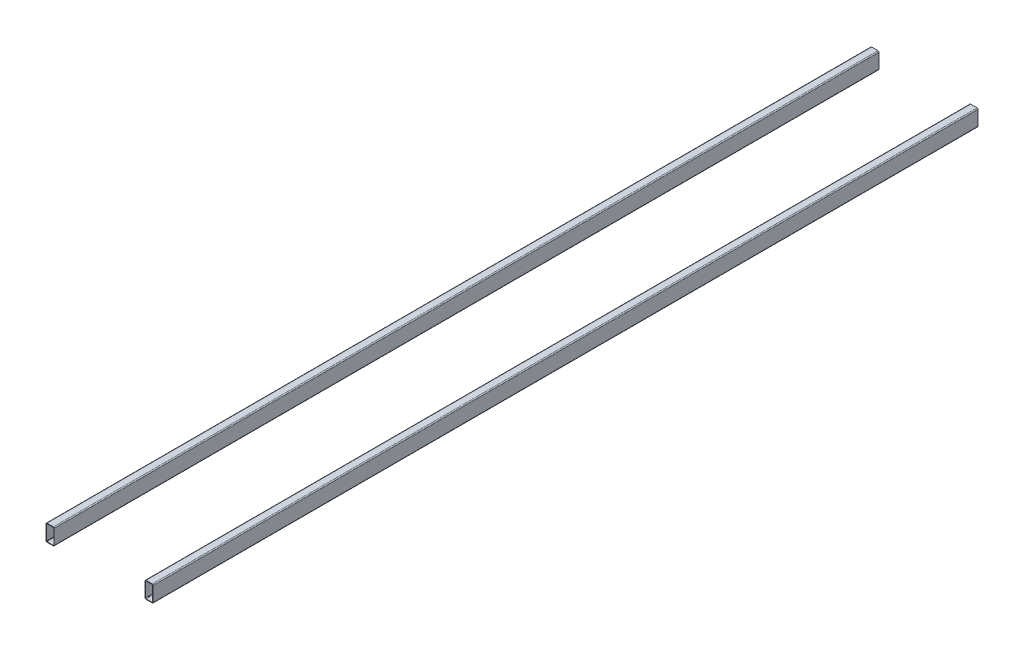
ISO-10303-21;
HEADER;
FILE_DESCRIPTION(('STEP AP214'),'2;1');
FILE_NAME('part.step','',(''),(''),'','','');
FILE_SCHEMA(('AUTOMOTIVE_DESIGN { 1 0 10303 214 1 1 1 1 }'));
ENDSEC;
DATA;
#1=APPLICATION_CONTEXT('core data for automotive mechanical design processes');
#2=APPLICATION_PROTOCOL_DEFINITION('international standard','automotive_design',2000,#1);
#3=PRODUCT_CONTEXT('',#1,'mechanical');
#4=PRODUCT('Part','Part','',(#3));
#5=PRODUCT_RELATED_PRODUCT_CATEGORY('part','',(#4));
#6=PRODUCT_DEFINITION_FORMATION('','',#4);
#7=PRODUCT_DEFINITION_CONTEXT('part definition',#1,'design');
#8=PRODUCT_DEFINITION('design','',#6,#7);
#9=PRODUCT_DEFINITION_SHAPE('','',#8);
#10=(LENGTH_UNIT() NAMED_UNIT(*) SI_UNIT(.MILLI.,.METRE.));
#11=(NAMED_UNIT(*) PLANE_ANGLE_UNIT() SI_UNIT($,.RADIAN.));
#12=(NAMED_UNIT(*) SI_UNIT($,.STERADIAN.) SOLID_ANGLE_UNIT());
#13=UNCERTAINTY_MEASURE_WITH_UNIT(LENGTH_MEASURE(1.E-05),#10,'distance_accuracy_value','');
#14=(GEOMETRIC_REPRESENTATION_CONTEXT(3) GLOBAL_UNCERTAINTY_ASSIGNED_CONTEXT((#13)) GLOBAL_UNIT_ASSIGNED_CONTEXT((#10,
#11,#12)) REPRESENTATION_CONTEXT('',''));
#15=CARTESIAN_POINT('',(0.,0.,0.));
#16=DIRECTION('',(0.,0.,1.));
#17=DIRECTION('',(1.,0.,0.));
#18=AXIS2_PLACEMENT_3D('',#15,#16,#17);
#19=CARTESIAN_POINT('',(281.,-44.,5000.));
#20=DIRECTION('',(0.,0.,1.));
#21=DIRECTION('',(1.,0.,0.));
#22=AXIS2_PLACEMENT_3D('',#19,#20,#21);
#23=PLANE('',#22);
#24=CARTESIAN_POINT('',(281.,-44.,5000.));
#25=DIRECTION('',(0.,0.,1.));
#26=DIRECTION('',(1.,0.,0.));
#27=AXIS2_PLACEMENT_3D('',#24,#25,#26);
#28=CIRCLE('',#27,6.00000000000002);
#29=CARTESIAN_POINT('',(275.,-44.,5000.));
#30=VERTEX_POINT('',#29);
#31=CARTESIAN_POINT('',(281.,-50.,5000.));
#32=VERTEX_POINT('',#31);
#33=EDGE_CURVE('E405',#30,#32,#28,.T.);
#34=ORIENTED_EDGE('',*,*,#33,.T.);
#35=DIRECTION('',(1.,0.,0.));
#36=VECTOR('',#35,1.);
#37=CARTESIAN_POINT('',(281.,-50.,5000.));
#38=LINE('',#37,#36);
#39=CARTESIAN_POINT('',(319.,-50.,5000.));
#40=VERTEX_POINT('',#39);
#41=EDGE_CURVE('E396',#32,#40,#38,.T.);
#42=ORIENTED_EDGE('',*,*,#41,.T.);
#43=CARTESIAN_POINT('',(319.,-44.,5000.));
#44=DIRECTION('',(0.,0.,1.));
#45=DIRECTION('',(1.,0.,0.));
#46=AXIS2_PLACEMENT_3D('',#43,#44,#45);
#47=CIRCLE('',#46,6.00000000000002);
#48=CARTESIAN_POINT('',(325.,-44.,5000.));
#49=VERTEX_POINT('',#48);
#50=EDGE_CURVE('E397',#40,#49,#47,.T.);
#51=ORIENTED_EDGE('',*,*,#50,.T.);
#52=DIRECTION('',(0.,1.,0.));
#53=VECTOR('',#52,1.);
#54=CARTESIAN_POINT('',(325.,-44.,5000.));
#55=LINE('',#54,#53);
#56=CARTESIAN_POINT('',(325.,44.,5000.));
#57=VERTEX_POINT('',#56);
#58=EDGE_CURVE('E391',#49,#57,#55,.T.);
#59=ORIENTED_EDGE('',*,*,#58,.T.);
#60=CARTESIAN_POINT('',(319.,44.,5000.));
#61=DIRECTION('',(0.,0.,1.));
#62=DIRECTION('',(1.,0.,0.));
#63=AXIS2_PLACEMENT_3D('',#60,#61,#62);
#64=CIRCLE('',#63,6.00000000000002);
#65=CARTESIAN_POINT('',(319.,50.,5000.));
#66=VERTEX_POINT('',#65);
#67=EDGE_CURVE('E388',#57,#66,#64,.T.);
#68=ORIENTED_EDGE('',*,*,#67,.T.);
#69=DIRECTION('',(-1.,0.,0.));
#70=VECTOR('',#69,1.);
#71=CARTESIAN_POINT('',(319.,50.,5000.));
#72=LINE('',#71,#70);
#73=CARTESIAN_POINT('',(281.,50.,5000.));
#74=VERTEX_POINT('',#73);
#75=EDGE_CURVE('E390',#66,#74,#72,.T.);
#76=ORIENTED_EDGE('',*,*,#75,.T.);
#77=CARTESIAN_POINT('',(281.,44.,5000.));
#78=DIRECTION('',(0.,0.,1.));
#79=DIRECTION('',(1.,0.,0.));
#80=AXIS2_PLACEMENT_3D('',#77,#78,#79);
#81=CIRCLE('',#80,6.00000000000002);
#82=CARTESIAN_POINT('',(275.,44.,5000.));
#83=VERTEX_POINT('',#82);
#84=EDGE_CURVE('E383',#74,#83,#81,.T.);
#85=ORIENTED_EDGE('',*,*,#84,.T.);
#86=DIRECTION('',(0.,-1.,0.));
#87=VECTOR('',#86,1.);
#88=CARTESIAN_POINT('',(275.,44.,5000.));
#89=LINE('',#88,#87);
#90=EDGE_CURVE('E381',#83,#30,#89,.T.);
#91=ORIENTED_EDGE('',*,*,#90,.T.);
#92=EDGE_LOOP('',(#34,#42,#51,#59,#68,#76,#85,#91));
#93=FACE_BOUND('',#92,.T.);
#94=DIRECTION('',(1.,0.,0.));
#95=VECTOR('',#94,1.);
#96=CARTESIAN_POINT('',(281.,-47.,5000.));
#97=LINE('',#96,#95);
#98=CARTESIAN_POINT('',(281.,-47.,5000.));
#99=VERTEX_POINT('',#98);
#100=CARTESIAN_POINT('',(319.,-47.,5000.));
#101=VERTEX_POINT('',#100);
#102=EDGE_CURVE('E100',#99,#101,#97,.T.);
#103=ORIENTED_EDGE('',*,*,#102,.F.);
#104=CARTESIAN_POINT('',(281.,-44.,5000.));
#105=DIRECTION('',(0.,0.,1.));
#106=DIRECTION('',(1.,0.,0.));
#107=AXIS2_PLACEMENT_3D('',#104,#105,#106);
#108=CIRCLE('',#107,3.00000000000002);
#109=CARTESIAN_POINT('',(278.,-44.,5000.));
#110=VERTEX_POINT('',#109);
#111=EDGE_CURVE('E56',#110,#99,#108,.T.);
#112=ORIENTED_EDGE('',*,*,#111,.F.);
#113=DIRECTION('',(0.,-1.,0.));
#114=VECTOR('',#113,1.);
#115=CARTESIAN_POINT('',(278.,44.,5000.));
#116=LINE('',#115,#114);
#117=CARTESIAN_POINT('',(278.,44.,5000.));
#118=VERTEX_POINT('',#117);
#119=EDGE_CURVE('E152',#118,#110,#116,.T.);
#120=ORIENTED_EDGE('',*,*,#119,.F.);
#121=CARTESIAN_POINT('',(281.,44.,5000.));
#122=DIRECTION('',(0.,0.,1.));
#123=DIRECTION('',(1.,0.,0.));
#124=AXIS2_PLACEMENT_3D('',#121,#122,#123);
#125=CIRCLE('',#124,3.00000000000002);
#126=CARTESIAN_POINT('',(281.,47.,5000.));
#127=VERTEX_POINT('',#126);
#128=EDGE_CURVE('E156',#127,#118,#125,.T.);
#129=ORIENTED_EDGE('',*,*,#128,.F.);
#130=DIRECTION('',(-1.,0.,0.));
#131=VECTOR('',#130,1.);
#132=CARTESIAN_POINT('',(319.,47.,5000.));
#133=LINE('',#132,#131);
#134=CARTESIAN_POINT('',(319.,47.,5000.));
#135=VERTEX_POINT('',#134);
#136=EDGE_CURVE('E157',#135,#127,#133,.T.);
#137=ORIENTED_EDGE('',*,*,#136,.F.);
#138=CARTESIAN_POINT('',(319.,44.,5000.));
#139=DIRECTION('',(0.,0.,1.));
#140=DIRECTION('',(1.,0.,0.));
#141=AXIS2_PLACEMENT_3D('',#138,#139,#140);
#142=CIRCLE('',#141,3.00000000000002);
#143=CARTESIAN_POINT('',(322.,44.,5000.));
#144=VERTEX_POINT('',#143);
#145=EDGE_CURVE('E161',#144,#135,#142,.T.);
#146=ORIENTED_EDGE('',*,*,#145,.F.);
#147=DIRECTION('',(0.,1.,0.));
#148=VECTOR('',#147,1.);
#149=CARTESIAN_POINT('',(322.,-44.,5000.));
#150=LINE('',#149,#148);
#151=CARTESIAN_POINT('',(322.,-44.,5000.));
#152=VERTEX_POINT('',#151);
#153=EDGE_CURVE('E162',#152,#144,#150,.T.);
#154=ORIENTED_EDGE('',*,*,#153,.F.);
#155=CARTESIAN_POINT('',(319.,-44.,5000.));
#156=DIRECTION('',(0.,0.,1.));
#157=DIRECTION('',(1.,0.,0.));
#158=AXIS2_PLACEMENT_3D('',#155,#156,#157);
#159=CIRCLE('',#158,3.00000000000002);
#160=EDGE_CURVE('E132',#101,#152,#159,.T.);
#161=ORIENTED_EDGE('',*,*,#160,.F.);
#162=EDGE_LOOP('',(#103,#112,#120,#129,#137,#146,#154,#161));
#163=FACE_BOUND('',#162,.T.);
#164=ADVANCED_FACE('F54',(#93,#163),#23,.T.);
#165=CARTESIAN_POINT('',(281.,-44.,0.));
#166=DIRECTION('',(0.,0.,1.));
#167=DIRECTION('',(1.,0.,0.));
#168=AXIS2_PLACEMENT_3D('',#165,#166,#167);
#169=PLANE('',#168);
#170=CARTESIAN_POINT('',(281.,-44.,0.));
#171=DIRECTION('',(0.,0.,1.));
#172=DIRECTION('',(1.,0.,0.));
#173=AXIS2_PLACEMENT_3D('',#170,#171,#172);
#174=CIRCLE('',#173,6.00000000000002);
#175=CARTESIAN_POINT('',(275.,-44.,0.));
#176=VERTEX_POINT('',#175);
#177=CARTESIAN_POINT('',(281.,-50.,0.));
#178=VERTEX_POINT('',#177);
#179=EDGE_CURVE('E363',#176,#178,#174,.T.);
#180=ORIENTED_EDGE('',*,*,#179,.F.);
#181=DIRECTION('',(0.,-1.,0.));
#182=VECTOR('',#181,1.);
#183=CARTESIAN_POINT('',(275.,44.,0.));
#184=LINE('',#183,#182);
#185=CARTESIAN_POINT('',(275.,44.,0.));
#186=VERTEX_POINT('',#185);
#187=EDGE_CURVE('E401',#186,#176,#184,.T.);
#188=ORIENTED_EDGE('',*,*,#187,.F.);
#189=CARTESIAN_POINT('',(281.,44.,0.));
#190=DIRECTION('',(0.,0.,1.));
#191=DIRECTION('',(1.,0.,0.));
#192=AXIS2_PLACEMENT_3D('',#189,#190,#191);
#193=CIRCLE('',#192,6.00000000000002);
#194=CARTESIAN_POINT('',(281.,50.,0.));
#195=VERTEX_POINT('',#194);
#196=EDGE_CURVE('E459',#195,#186,#193,.T.);
#197=ORIENTED_EDGE('',*,*,#196,.F.);
#198=DIRECTION('',(-1.,0.,0.));
#199=VECTOR('',#198,1.);
#200=CARTESIAN_POINT('',(319.,50.,0.));
#201=LINE('',#200,#199);
#202=CARTESIAN_POINT('',(319.,50.,0.));
#203=VERTEX_POINT('',#202);
#204=EDGE_CURVE('E463',#203,#195,#201,.T.);
#205=ORIENTED_EDGE('',*,*,#204,.F.);
#206=CARTESIAN_POINT('',(319.,44.,0.));
#207=DIRECTION('',(0.,0.,1.));
#208=DIRECTION('',(1.,0.,0.));
#209=AXIS2_PLACEMENT_3D('',#206,#207,#208);
#210=CIRCLE('',#209,6.00000000000002);
#211=CARTESIAN_POINT('',(325.,44.,0.));
#212=VERTEX_POINT('',#211);
#213=EDGE_CURVE('E461',#212,#203,#210,.T.);
#214=ORIENTED_EDGE('',*,*,#213,.F.);
#215=DIRECTION('',(0.,1.,0.));
#216=VECTOR('',#215,1.);
#217=CARTESIAN_POINT('',(325.,-44.,0.));
#218=LINE('',#217,#216);
#219=CARTESIAN_POINT('',(325.,-44.,0.));
#220=VERTEX_POINT('',#219);
#221=EDGE_CURVE('E464',#220,#212,#218,.T.);
#222=ORIENTED_EDGE('',*,*,#221,.F.);
#223=CARTESIAN_POINT('',(319.,-44.,0.));
#224=DIRECTION('',(0.,0.,1.));
#225=DIRECTION('',(1.,0.,0.));
#226=AXIS2_PLACEMENT_3D('',#223,#224,#225);
#227=CIRCLE('',#226,6.00000000000002);
#228=CARTESIAN_POINT('',(319.,-50.,0.));
#229=VERTEX_POINT('',#228);
#230=EDGE_CURVE('E380',#229,#220,#227,.T.);
#231=ORIENTED_EDGE('',*,*,#230,.F.);
#232=DIRECTION('',(1.,0.,0.));
#233=VECTOR('',#232,1.);
#234=CARTESIAN_POINT('',(281.,-50.,0.));
#235=LINE('',#234,#233);
#236=EDGE_CURVE('E373',#178,#229,#235,.T.);
#237=ORIENTED_EDGE('',*,*,#236,.F.);
#238=EDGE_LOOP('',(#180,#188,#197,#205,#214,#222,#231,#237));
#239=FACE_BOUND('',#238,.T.);
#240=CARTESIAN_POINT('',(281.,-44.,0.));
#241=DIRECTION('',(0.,0.,1.));
#242=DIRECTION('',(1.,0.,0.));
#243=AXIS2_PLACEMENT_3D('',#240,#241,#242);
#244=CIRCLE('',#243,3.00000000000002);
#245=CARTESIAN_POINT('',(278.,-44.,0.));
#246=VERTEX_POINT('',#245);
#247=CARTESIAN_POINT('',(281.,-47.,0.));
#248=VERTEX_POINT('',#247);
#249=EDGE_CURVE('E12',#246,#248,#244,.T.);
#250=ORIENTED_EDGE('',*,*,#249,.T.);
#251=DIRECTION('',(1.,0.,0.));
#252=VECTOR('',#251,1.);
#253=CARTESIAN_POINT('',(281.,-47.,0.));
#254=LINE('',#253,#252);
#255=CARTESIAN_POINT('',(319.,-47.,0.));
#256=VERTEX_POINT('',#255);
#257=EDGE_CURVE('E64',#248,#256,#254,.T.);
#258=ORIENTED_EDGE('',*,*,#257,.T.);
#259=CARTESIAN_POINT('',(319.,-44.,0.));
#260=DIRECTION('',(0.,0.,1.));
#261=DIRECTION('',(1.,0.,0.));
#262=AXIS2_PLACEMENT_3D('',#259,#260,#261);
#263=CIRCLE('',#262,3.00000000000002);
#264=CARTESIAN_POINT('',(322.,-44.,0.));
#265=VERTEX_POINT('',#264);
#266=EDGE_CURVE('E135',#256,#265,#263,.T.);
#267=ORIENTED_EDGE('',*,*,#266,.T.);
#268=DIRECTION('',(0.,1.,0.));
#269=VECTOR('',#268,1.);
#270=CARTESIAN_POINT('',(322.,-44.,0.));
#271=LINE('',#270,#269);
#272=CARTESIAN_POINT('',(322.,44.,0.));
#273=VERTEX_POINT('',#272);
#274=EDGE_CURVE('E143',#265,#273,#271,.T.);
#275=ORIENTED_EDGE('',*,*,#274,.T.);
#276=CARTESIAN_POINT('',(319.,44.,0.));
#277=DIRECTION('',(0.,0.,1.));
#278=DIRECTION('',(1.,0.,0.));
#279=AXIS2_PLACEMENT_3D('',#276,#277,#278);
#280=CIRCLE('',#279,3.00000000000002);
#281=CARTESIAN_POINT('',(319.,47.,0.));
#282=VERTEX_POINT('',#281);
#283=EDGE_CURVE('E150',#273,#282,#280,.T.);
#284=ORIENTED_EDGE('',*,*,#283,.T.);
#285=DIRECTION('',(-1.,0.,0.));
#286=VECTOR('',#285,1.);
#287=CARTESIAN_POINT('',(319.,47.,0.));
#288=LINE('',#287,#286);
#289=CARTESIAN_POINT('',(281.,47.,0.));
#290=VERTEX_POINT('',#289);
#291=EDGE_CURVE('E173',#282,#290,#288,.T.);
#292=ORIENTED_EDGE('',*,*,#291,.T.);
#293=CARTESIAN_POINT('',(281.,44.,0.));
#294=DIRECTION('',(0.,0.,1.));
#295=DIRECTION('',(1.,0.,0.));
#296=AXIS2_PLACEMENT_3D('',#293,#294,#295);
#297=CIRCLE('',#296,3.00000000000002);
#298=CARTESIAN_POINT('',(278.,44.,0.));
#299=VERTEX_POINT('',#298);
#300=EDGE_CURVE('E170',#290,#299,#297,.T.);
#301=ORIENTED_EDGE('',*,*,#300,.T.);
#302=DIRECTION('',(0.,-1.,0.));
#303=VECTOR('',#302,1.);
#304=CARTESIAN_POINT('',(278.,44.,0.));
#305=LINE('',#304,#303);
#306=EDGE_CURVE('E164',#299,#246,#305,.T.);
#307=ORIENTED_EDGE('',*,*,#306,.T.);
#308=EDGE_LOOP('',(#250,#258,#267,#275,#284,#292,#301,#307));
#309=FACE_BOUND('',#308,.T.);
#310=ADVANCED_FACE('F149',(#239,#309),#169,.F.);
#311=CARTESIAN_POINT('',(281.,-44.,5000.));
#312=DIRECTION('',(0.,0.,-1.));
#313=DIRECTION('',(-1.,0.,0.));
#314=AXIS2_PLACEMENT_3D('',#311,#312,#313);
#315=CYLINDRICAL_SURFACE('',#314,6.00000000000002);
#316=ORIENTED_EDGE('',*,*,#179,.T.);
#317=DIRECTION('',(0.,0.,-1.));
#318=VECTOR('',#317,1.);
#319=CARTESIAN_POINT('',(281.,-50.,5000.));
#320=LINE('',#319,#318);
#321=EDGE_CURVE('E365',#32,#178,#320,.T.);
#322=ORIENTED_EDGE('',*,*,#321,.F.);
#323=ORIENTED_EDGE('',*,*,#33,.F.);
#324=DIRECTION('',(0.,0.,-1.));
#325=VECTOR('',#324,1.);
#326=CARTESIAN_POINT('',(275.,-44.,5000.));
#327=LINE('',#326,#325);
#328=EDGE_CURVE('E370',#30,#176,#327,.T.);
#329=ORIENTED_EDGE('',*,*,#328,.T.);
#330=EDGE_LOOP('',(#316,#322,#323,#329));
#331=FACE_BOUND('',#330,.T.);
#332=ADVANCED_FACE('F202',(#331),#315,.T.);
#333=CARTESIAN_POINT('',(281.,-50.,5000.));
#334=DIRECTION('',(0.,1.,0.));
#335=DIRECTION('',(0.,0.,1.));
#336=AXIS2_PLACEMENT_3D('',#333,#334,#335);
#337=PLANE('',#336);
#338=ORIENTED_EDGE('',*,*,#236,.T.);
#339=DIRECTION('',(0.,0.,-1.));
#340=VECTOR('',#339,1.);
#341=CARTESIAN_POINT('',(319.,-50.,5000.));
#342=LINE('',#341,#340);
#343=EDGE_CURVE('E448',#40,#229,#342,.T.);
#344=ORIENTED_EDGE('',*,*,#343,.F.);
#345=ORIENTED_EDGE('',*,*,#41,.F.);
#346=ORIENTED_EDGE('',*,*,#321,.T.);
#347=EDGE_LOOP('',(#338,#344,#345,#346));
#348=FACE_BOUND('',#347,.T.);
#349=ADVANCED_FACE('F316',(#348),#337,.F.);
#350=CARTESIAN_POINT('',(319.,-44.,5000.));
#351=DIRECTION('',(0.,0.,-1.));
#352=DIRECTION('',(-1.,0.,0.));
#353=AXIS2_PLACEMENT_3D('',#350,#351,#352);
#354=CYLINDRICAL_SURFACE('',#353,6.00000000000002);
#355=ORIENTED_EDGE('',*,*,#230,.T.);
#356=DIRECTION('',(0.,0.,-1.));
#357=VECTOR('',#356,1.);
#358=CARTESIAN_POINT('',(325.,-44.,5000.));
#359=LINE('',#358,#357);
#360=EDGE_CURVE('E466',#49,#220,#359,.T.);
#361=ORIENTED_EDGE('',*,*,#360,.F.);
#362=ORIENTED_EDGE('',*,*,#50,.F.);
#363=ORIENTED_EDGE('',*,*,#343,.T.);
#364=EDGE_LOOP('',(#355,#361,#362,#363));
#365=FACE_BOUND('',#364,.T.);
#366=ADVANCED_FACE('F307',(#365),#354,.T.);
#367=CARTESIAN_POINT('',(325.,-44.,5000.));
#368=DIRECTION('',(-1.,0.,0.));
#369=DIRECTION('',(0.,0.,1.));
#370=AXIS2_PLACEMENT_3D('',#367,#368,#369);
#371=PLANE('',#370);
#372=ORIENTED_EDGE('',*,*,#221,.T.);
#373=DIRECTION('',(0.,0.,-1.));
#374=VECTOR('',#373,1.);
#375=CARTESIAN_POINT('',(325.,44.,5000.));
#376=LINE('',#375,#374);
#377=EDGE_CURVE('E475',#57,#212,#376,.T.);
#378=ORIENTED_EDGE('',*,*,#377,.F.);
#379=ORIENTED_EDGE('',*,*,#58,.F.);
#380=ORIENTED_EDGE('',*,*,#360,.T.);
#381=EDGE_LOOP('',(#372,#378,#379,#380));
#382=FACE_BOUND('',#381,.T.);
#383=ADVANCED_FACE('F296',(#382),#371,.F.);
#384=CARTESIAN_POINT('',(319.,44.,5000.));
#385=DIRECTION('',(0.,0.,-1.));
#386=DIRECTION('',(-1.,0.,0.));
#387=AXIS2_PLACEMENT_3D('',#384,#385,#386);
#388=CYLINDRICAL_SURFACE('',#387,6.00000000000002);
#389=ORIENTED_EDGE('',*,*,#213,.T.);
#390=DIRECTION('',(0.,0.,-1.));
#391=VECTOR('',#390,1.);
#392=CARTESIAN_POINT('',(319.,50.,5000.));
#393=LINE('',#392,#391);
#394=EDGE_CURVE('E485',#66,#203,#393,.T.);
#395=ORIENTED_EDGE('',*,*,#394,.F.);
#396=ORIENTED_EDGE('',*,*,#67,.F.);
#397=ORIENTED_EDGE('',*,*,#377,.T.);
#398=EDGE_LOOP('',(#389,#395,#396,#397));
#399=FACE_BOUND('',#398,.T.);
#400=ADVANCED_FACE('F286',(#399),#388,.T.);
#401=CARTESIAN_POINT('',(319.,50.,5000.));
#402=DIRECTION('',(0.,-1.,0.));
#403=DIRECTION('',(0.,0.,-1.));
#404=AXIS2_PLACEMENT_3D('',#401,#402,#403);
#405=PLANE('',#404);
#406=ORIENTED_EDGE('',*,*,#204,.T.);
#407=DIRECTION('',(0.,0.,-1.));
#408=VECTOR('',#407,1.);
#409=CARTESIAN_POINT('',(281.,50.,5000.));
#410=LINE('',#409,#408);
#411=EDGE_CURVE('E451',#74,#195,#410,.T.);
#412=ORIENTED_EDGE('',*,*,#411,.F.);
#413=ORIENTED_EDGE('',*,*,#75,.F.);
#414=ORIENTED_EDGE('',*,*,#394,.T.);
#415=EDGE_LOOP('',(#406,#412,#413,#414));
#416=FACE_BOUND('',#415,.T.);
#417=ADVANCED_FACE('F278',(#416),#405,.F.);
#418=CARTESIAN_POINT('',(281.,44.,5000.));
#419=DIRECTION('',(0.,0.,-1.));
#420=DIRECTION('',(-1.,0.,0.));
#421=AXIS2_PLACEMENT_3D('',#418,#419,#420);
#422=CYLINDRICAL_SURFACE('',#421,6.00000000000002);
#423=ORIENTED_EDGE('',*,*,#196,.T.);
#424=DIRECTION('',(0.,0.,-1.));
#425=VECTOR('',#424,1.);
#426=CARTESIAN_POINT('',(275.,44.,5000.));
#427=LINE('',#426,#425);
#428=EDGE_CURVE('E454',#83,#186,#427,.T.);
#429=ORIENTED_EDGE('',*,*,#428,.F.);
#430=ORIENTED_EDGE('',*,*,#84,.F.);
#431=ORIENTED_EDGE('',*,*,#411,.T.);
#432=EDGE_LOOP('',(#423,#429,#430,#431));
#433=FACE_BOUND('',#432,.T.);
#434=ADVANCED_FACE('F275',(#433),#422,.T.);
#435=CARTESIAN_POINT('',(275.,44.,5000.));
#436=DIRECTION('',(1.,0.,0.));
#437=DIRECTION('',(0.,0.,-1.));
#438=AXIS2_PLACEMENT_3D('',#435,#436,#437);
#439=PLANE('',#438);
#440=ORIENTED_EDGE('',*,*,#187,.T.);
#441=ORIENTED_EDGE('',*,*,#328,.F.);
#442=ORIENTED_EDGE('',*,*,#90,.F.);
#443=ORIENTED_EDGE('',*,*,#428,.T.);
#444=EDGE_LOOP('',(#440,#441,#442,#443));
#445=FACE_BOUND('',#444,.T.);
#446=ADVANCED_FACE('F216',(#445),#439,.F.);
#447=CARTESIAN_POINT('',(281.,-44.,5000.));
#448=DIRECTION('',(0.,0.,-1.));
#449=DIRECTION('',(-1.,0.,0.));
#450=AXIS2_PLACEMENT_3D('',#447,#448,#449);
#451=CYLINDRICAL_SURFACE('',#450,3.00000000000002);
#452=ORIENTED_EDGE('',*,*,#249,.F.);
#453=DIRECTION('',(0.,0.,-1.));
#454=VECTOR('',#453,1.);
#455=CARTESIAN_POINT('',(278.,-44.,5000.));
#456=LINE('',#455,#454);
#457=EDGE_CURVE('E160',#110,#246,#456,.T.);
#458=ORIENTED_EDGE('',*,*,#457,.F.);
#459=ORIENTED_EDGE('',*,*,#111,.T.);
#460=DIRECTION('',(0.,0.,-1.));
#461=VECTOR('',#460,1.);
#462=CARTESIAN_POINT('',(281.,-47.,5000.));
#463=LINE('',#462,#461);
#464=EDGE_CURVE('E375',#99,#248,#463,.T.);
#465=ORIENTED_EDGE('',*,*,#464,.T.);
#466=EDGE_LOOP('',(#452,#458,#459,#465));
#467=FACE_BOUND('',#466,.T.);
#468=ADVANCED_FACE('F215',(#467),#451,.F.);
#469=CARTESIAN_POINT('',(281.,-47.,5000.));
#470=DIRECTION('',(0.,1.,0.));
#471=DIRECTION('',(0.,0.,1.));
#472=AXIS2_PLACEMENT_3D('',#469,#470,#471);
#473=PLANE('',#472);
#474=ORIENTED_EDGE('',*,*,#257,.F.);
#475=ORIENTED_EDGE('',*,*,#464,.F.);
#476=ORIENTED_EDGE('',*,*,#102,.T.);
#477=DIRECTION('',(0.,0.,-1.));
#478=VECTOR('',#477,1.);
#479=CARTESIAN_POINT('',(319.,-47.,5000.));
#480=LINE('',#479,#478);
#481=EDGE_CURVE('E140',#101,#256,#480,.T.);
#482=ORIENTED_EDGE('',*,*,#481,.T.);
#483=EDGE_LOOP('',(#474,#475,#476,#482));
#484=FACE_BOUND('',#483,.T.);
#485=ADVANCED_FACE('F214',(#484),#473,.T.);
#486=CARTESIAN_POINT('',(319.,-44.,5000.));
#487=DIRECTION('',(0.,0.,-1.));
#488=DIRECTION('',(-1.,0.,0.));
#489=AXIS2_PLACEMENT_3D('',#486,#487,#488);
#490=CYLINDRICAL_SURFACE('',#489,3.00000000000002);
#491=ORIENTED_EDGE('',*,*,#266,.F.);
#492=ORIENTED_EDGE('',*,*,#481,.F.);
#493=ORIENTED_EDGE('',*,*,#160,.T.);
#494=DIRECTION('',(0.,0.,-1.));
#495=VECTOR('',#494,1.);
#496=CARTESIAN_POINT('',(322.,-44.,5000.));
#497=LINE('',#496,#495);
#498=EDGE_CURVE('E126',#152,#265,#497,.T.);
#499=ORIENTED_EDGE('',*,*,#498,.T.);
#500=EDGE_LOOP('',(#491,#492,#493,#499));
#501=FACE_BOUND('',#500,.T.);
#502=ADVANCED_FACE('F128',(#501),#490,.F.);
#503=CARTESIAN_POINT('',(322.,-44.,5000.));
#504=DIRECTION('',(-1.,0.,0.));
#505=DIRECTION('',(0.,0.,1.));
#506=AXIS2_PLACEMENT_3D('',#503,#504,#505);
#507=PLANE('',#506);
#508=ORIENTED_EDGE('',*,*,#274,.F.);
#509=ORIENTED_EDGE('',*,*,#498,.F.);
#510=ORIENTED_EDGE('',*,*,#153,.T.);
#511=DIRECTION('',(0.,0.,-1.));
#512=VECTOR('',#511,1.);
#513=CARTESIAN_POINT('',(322.,44.,5000.));
#514=LINE('',#513,#512);
#515=EDGE_CURVE('E139',#144,#273,#514,.T.);
#516=ORIENTED_EDGE('',*,*,#515,.T.);
#517=EDGE_LOOP('',(#508,#509,#510,#516));
#518=FACE_BOUND('',#517,.T.);
#519=ADVANCED_FACE('F142',(#518),#507,.T.);
#520=CARTESIAN_POINT('',(319.,44.,5000.));
#521=DIRECTION('',(0.,0.,-1.));
#522=DIRECTION('',(-1.,0.,0.));
#523=AXIS2_PLACEMENT_3D('',#520,#521,#522);
#524=CYLINDRICAL_SURFACE('',#523,3.00000000000002);
#525=ORIENTED_EDGE('',*,*,#283,.F.);
#526=ORIENTED_EDGE('',*,*,#515,.F.);
#527=ORIENTED_EDGE('',*,*,#145,.T.);
#528=DIRECTION('',(0.,0.,-1.));
#529=VECTOR('',#528,1.);
#530=CARTESIAN_POINT('',(319.,47.,5000.));
#531=LINE('',#530,#529);
#532=EDGE_CURVE('E185',#135,#282,#531,.T.);
#533=ORIENTED_EDGE('',*,*,#532,.T.);
#534=EDGE_LOOP('',(#525,#526,#527,#533));
#535=FACE_BOUND('',#534,.T.);
#536=ADVANCED_FACE('F176',(#535),#524,.F.);
#537=CARTESIAN_POINT('',(319.,47.,5000.));
#538=DIRECTION('',(0.,-1.,0.));
#539=DIRECTION('',(0.,0.,-1.));
#540=AXIS2_PLACEMENT_3D('',#537,#538,#539);
#541=PLANE('',#540);
#542=ORIENTED_EDGE('',*,*,#291,.F.);
#543=ORIENTED_EDGE('',*,*,#532,.F.);
#544=ORIENTED_EDGE('',*,*,#136,.T.);
#545=DIRECTION('',(0.,0.,-1.));
#546=VECTOR('',#545,1.);
#547=CARTESIAN_POINT('',(281.,47.,5000.));
#548=LINE('',#547,#546);
#549=EDGE_CURVE('E183',#127,#290,#548,.T.);
#550=ORIENTED_EDGE('',*,*,#549,.T.);
#551=EDGE_LOOP('',(#542,#543,#544,#550));
#552=FACE_BOUND('',#551,.T.);
#553=ADVANCED_FACE('F190',(#552),#541,.T.);
#554=CARTESIAN_POINT('',(281.,44.,5000.));
#555=DIRECTION('',(0.,0.,-1.));
#556=DIRECTION('',(-1.,0.,0.));
#557=AXIS2_PLACEMENT_3D('',#554,#555,#556);
#558=CYLINDRICAL_SURFACE('',#557,3.00000000000002);
#559=ORIENTED_EDGE('',*,*,#300,.F.);
#560=ORIENTED_EDGE('',*,*,#549,.F.);
#561=ORIENTED_EDGE('',*,*,#128,.T.);
#562=DIRECTION('',(0.,0.,-1.));
#563=VECTOR('',#562,1.);
#564=CARTESIAN_POINT('',(278.,44.,5000.));
#565=LINE('',#564,#563);
#566=EDGE_CURVE('E112',#118,#299,#565,.T.);
#567=ORIENTED_EDGE('',*,*,#566,.T.);
#568=EDGE_LOOP('',(#559,#560,#561,#567));
#569=FACE_BOUND('',#568,.T.);
#570=ADVANCED_FACE('F192',(#569),#558,.F.);
#571=CARTESIAN_POINT('',(278.,44.,5000.));
#572=DIRECTION('',(1.,0.,0.));
#573=DIRECTION('',(0.,0.,-1.));
#574=AXIS2_PLACEMENT_3D('',#571,#572,#573);
#575=PLANE('',#574);
#576=ORIENTED_EDGE('',*,*,#306,.F.);
#577=ORIENTED_EDGE('',*,*,#566,.F.);
#578=ORIENTED_EDGE('',*,*,#119,.T.);
#579=ORIENTED_EDGE('',*,*,#457,.T.);
#580=EDGE_LOOP('',(#576,#577,#578,#579));
#581=FACE_BOUND('',#580,.T.);
#582=ADVANCED_FACE('F60',(#581),#575,.T.);
#583=CLOSED_SHELL('',(#164,#310,#332,#349,#366,#383,#400,#417,#434,#446,#468,#485,#502,#519,
#536,#553,#570,#582));
#584=MANIFOLD_SOLID_BREP('B2',#583);
#585=CARTESIAN_POINT('',(-319.,-44.,5000.));
#586=DIRECTION('',(0.,0.,1.));
#587=DIRECTION('',(1.,0.,0.));
#588=AXIS2_PLACEMENT_3D('',#585,#586,#587);
#589=PLANE('',#588);
#590=CARTESIAN_POINT('',(-319.,-44.,5000.));
#591=DIRECTION('',(0.,0.,1.));
#592=DIRECTION('',(1.,0.,0.));
#593=AXIS2_PLACEMENT_3D('',#590,#591,#592);
#594=CIRCLE('',#593,6.00000000000002);
#595=CARTESIAN_POINT('',(-325.,-44.,5000.));
#596=VERTEX_POINT('',#595);
#597=CARTESIAN_POINT('',(-319.,-50.,5000.));
#598=VERTEX_POINT('',#597);
#599=EDGE_CURVE('E698',#596,#598,#594,.T.);
#600=ORIENTED_EDGE('',*,*,#599,.T.);
#601=DIRECTION('',(1.,0.,0.));
#602=VECTOR('',#601,1.);
#603=CARTESIAN_POINT('',(-319.,-50.,5000.));
#604=LINE('',#603,#602);
#605=CARTESIAN_POINT('',(-281.,-50.,5000.));
#606=VERTEX_POINT('',#605);
#607=EDGE_CURVE('E697',#598,#606,#604,.T.);
#608=ORIENTED_EDGE('',*,*,#607,.T.);
#609=CARTESIAN_POINT('',(-281.,-44.,5000.));
#610=DIRECTION('',(0.,0.,1.));
#611=DIRECTION('',(1.,0.,0.));
#612=AXIS2_PLACEMENT_3D('',#609,#610,#611);
#613=CIRCLE('',#612,6.00000000000002);
#614=CARTESIAN_POINT('',(-275.,-44.,5000.));
#615=VERTEX_POINT('',#614);
#616=EDGE_CURVE('E702',#606,#615,#613,.T.);
#617=ORIENTED_EDGE('',*,*,#616,.T.);
#618=DIRECTION('',(0.,1.,0.));
#619=VECTOR('',#618,1.);
#620=CARTESIAN_POINT('',(-275.,-44.,5000.));
#621=LINE('',#620,#619);
#622=CARTESIAN_POINT('',(-275.,44.,5000.));
#623=VERTEX_POINT('',#622);
#624=EDGE_CURVE('E710',#615,#623,#621,.T.);
#625=ORIENTED_EDGE('',*,*,#624,.T.);
#626=CARTESIAN_POINT('',(-281.,44.,5000.));
#627=DIRECTION('',(0.,0.,1.));
#628=DIRECTION('',(1.,0.,0.));
#629=AXIS2_PLACEMENT_3D('',#626,#627,#628);
#630=CIRCLE('',#629,6.00000000000002);
#631=CARTESIAN_POINT('',(-281.,50.,5000.));
#632=VERTEX_POINT('',#631);
#633=EDGE_CURVE('E709',#623,#632,#630,.T.);
#634=ORIENTED_EDGE('',*,*,#633,.T.);
#635=DIRECTION('',(-1.,0.,0.));
#636=VECTOR('',#635,1.);
#637=CARTESIAN_POINT('',(-281.,50.,5000.));
#638=LINE('',#637,#636);
#639=CARTESIAN_POINT('',(-319.,50.,5000.));
#640=VERTEX_POINT('',#639);
#641=EDGE_CURVE('E712',#632,#640,#638,.T.);
#642=ORIENTED_EDGE('',*,*,#641,.T.);
#643=CARTESIAN_POINT('',(-319.,44.,5000.));
#644=DIRECTION('',(0.,0.,1.));
#645=DIRECTION('',(1.,0.,0.));
#646=AXIS2_PLACEMENT_3D('',#643,#644,#645);
#647=CIRCLE('',#646,6.00000000000002);
#648=CARTESIAN_POINT('',(-325.,44.,5000.));
#649=VERTEX_POINT('',#648);
#650=EDGE_CURVE('E717',#640,#649,#647,.T.);
#651=ORIENTED_EDGE('',*,*,#650,.T.);
#652=DIRECTION('',(0.,-1.,0.));
#653=VECTOR('',#652,1.);
#654=CARTESIAN_POINT('',(-325.,44.,5000.));
#655=LINE('',#654,#653);
#656=EDGE_CURVE('E716',#649,#596,#655,.T.);
#657=ORIENTED_EDGE('',*,*,#656,.T.);
#658=EDGE_LOOP('',(#600,#608,#617,#625,#634,#642,#651,#657));
#659=FACE_BOUND('',#658,.T.);
#660=DIRECTION('',(1.,0.,0.));
#661=VECTOR('',#660,1.);
#662=CARTESIAN_POINT('',(-319.,-47.,5000.));
#663=LINE('',#662,#661);
#664=CARTESIAN_POINT('',(-319.,-47.,5000.));
#665=VERTEX_POINT('',#664);
#666=CARTESIAN_POINT('',(-281.,-47.,5000.));
#667=VERTEX_POINT('',#666);
#668=EDGE_CURVE('E617',#665,#667,#663,.T.);
#669=ORIENTED_EDGE('',*,*,#668,.F.);
#670=CARTESIAN_POINT('',(-319.,-44.,5000.));
#671=DIRECTION('',(0.,0.,1.));
#672=DIRECTION('',(1.,0.,0.));
#673=AXIS2_PLACEMENT_3D('',#670,#671,#672);
#674=CIRCLE('',#673,3.00000000000002);
#675=CARTESIAN_POINT('',(-322.,-44.,5000.));
#676=VERTEX_POINT('',#675);
#677=EDGE_CURVE('E610',#676,#665,#674,.T.);
#678=ORIENTED_EDGE('',*,*,#677,.F.);
#679=DIRECTION('',(0.,-1.,0.));
#680=VECTOR('',#679,1.);
#681=CARTESIAN_POINT('',(-322.,44.,5000.));
#682=LINE('',#681,#680);
#683=CARTESIAN_POINT('',(-322.,44.,5000.));
#684=VERTEX_POINT('',#683);
#685=EDGE_CURVE('E648',#684,#676,#682,.T.);
#686=ORIENTED_EDGE('',*,*,#685,.F.);
#687=CARTESIAN_POINT('',(-319.,44.,5000.));
#688=DIRECTION('',(0.,0.,1.));
#689=DIRECTION('',(1.,0.,0.));
#690=AXIS2_PLACEMENT_3D('',#687,#688,#689);
#691=CIRCLE('',#690,3.00000000000002);
#692=CARTESIAN_POINT('',(-319.,47.,5000.));
#693=VERTEX_POINT('',#692);
#694=EDGE_CURVE('E642',#693,#684,#691,.T.);
#695=ORIENTED_EDGE('',*,*,#694,.F.);
#696=DIRECTION('',(-1.,0.,0.));
#697=VECTOR('',#696,1.);
#698=CARTESIAN_POINT('',(-281.,47.,5000.));
#699=LINE('',#698,#697);
#700=CARTESIAN_POINT('',(-281.,47.,5000.));
#701=VERTEX_POINT('',#700);
#702=EDGE_CURVE('E645',#701,#693,#699,.T.);
#703=ORIENTED_EDGE('',*,*,#702,.F.);
#704=CARTESIAN_POINT('',(-281.,44.,5000.));
#705=DIRECTION('',(0.,0.,1.));
#706=DIRECTION('',(1.,0.,0.));
#707=AXIS2_PLACEMENT_3D('',#704,#705,#706);
#708=CIRCLE('',#707,3.00000000000002);
#709=CARTESIAN_POINT('',(-278.,44.,5000.));
#710=VERTEX_POINT('',#709);
#711=EDGE_CURVE('E640',#710,#701,#708,.T.);
#712=ORIENTED_EDGE('',*,*,#711,.F.);
#713=DIRECTION('',(0.,1.,0.));
#714=VECTOR('',#713,1.);
#715=CARTESIAN_POINT('',(-278.,-44.,5000.));
#716=LINE('',#715,#714);
#717=CARTESIAN_POINT('',(-278.,-44.,5000.));
#718=VERTEX_POINT('',#717);
#719=EDGE_CURVE('E631',#718,#710,#716,.T.);
#720=ORIENTED_EDGE('',*,*,#719,.F.);
#721=CARTESIAN_POINT('',(-281.,-44.,5000.));
#722=DIRECTION('',(0.,0.,1.));
#723=DIRECTION('',(1.,0.,0.));
#724=AXIS2_PLACEMENT_3D('',#721,#722,#723);
#725=CIRCLE('',#724,3.00000000000002);
#726=EDGE_CURVE('E629',#667,#718,#725,.T.);
#727=ORIENTED_EDGE('',*,*,#726,.F.);
#728=EDGE_LOOP('',(#669,#678,#686,#695,#703,#712,#720,#727));
#729=FACE_BOUND('',#728,.T.);
#730=ADVANCED_FACE('F492',(#659,#729),#589,.T.);
#731=CARTESIAN_POINT('',(-319.,-44.,0.));
#732=DIRECTION('',(0.,0.,1.));
#733=DIRECTION('',(1.,0.,0.));
#734=AXIS2_PLACEMENT_3D('',#731,#732,#733);
#735=PLANE('',#734);
#736=CARTESIAN_POINT('',(-319.,-44.,0.));
#737=DIRECTION('',(0.,0.,1.));
#738=DIRECTION('',(1.,0.,0.));
#739=AXIS2_PLACEMENT_3D('',#736,#737,#738);
#740=CIRCLE('',#739,6.00000000000002);
#741=CARTESIAN_POINT('',(-325.,-44.,0.));
#742=VERTEX_POINT('',#741);
#743=CARTESIAN_POINT('',(-319.,-50.,0.));
#744=VERTEX_POINT('',#743);
#745=EDGE_CURVE('E623',#742,#744,#740,.T.);
#746=ORIENTED_EDGE('',*,*,#745,.F.);
#747=DIRECTION('',(0.,-1.,0.));
#748=VECTOR('',#747,1.);
#749=CARTESIAN_POINT('',(-325.,44.,0.));
#750=LINE('',#749,#748);
#751=CARTESIAN_POINT('',(-325.,44.,0.));
#752=VERTEX_POINT('',#751);
#753=EDGE_CURVE('E701',#752,#742,#750,.T.);
#754=ORIENTED_EDGE('',*,*,#753,.F.);
#755=CARTESIAN_POINT('',(-319.,44.,0.));
#756=DIRECTION('',(0.,0.,1.));
#757=DIRECTION('',(1.,0.,0.));
#758=AXIS2_PLACEMENT_3D('',#755,#756,#757);
#759=CIRCLE('',#758,6.00000000000002);
#760=CARTESIAN_POINT('',(-319.,50.,0.));
#761=VERTEX_POINT('',#760);
#762=EDGE_CURVE('E742',#761,#752,#759,.T.);
#763=ORIENTED_EDGE('',*,*,#762,.F.);
#764=DIRECTION('',(-1.,0.,0.));
#765=VECTOR('',#764,1.);
#766=CARTESIAN_POINT('',(-281.,50.,0.));
#767=LINE('',#766,#765);
#768=CARTESIAN_POINT('',(-281.,50.,0.));
#769=VERTEX_POINT('',#768);
#770=EDGE_CURVE('E736',#769,#761,#767,.T.);
#771=ORIENTED_EDGE('',*,*,#770,.F.);
#772=CARTESIAN_POINT('',(-281.,44.,0.));
#773=DIRECTION('',(0.,0.,1.));
#774=DIRECTION('',(1.,0.,0.));
#775=AXIS2_PLACEMENT_3D('',#772,#773,#774);
#776=CIRCLE('',#775,6.00000000000002);
#777=CARTESIAN_POINT('',(-275.,44.,0.));
#778=VERTEX_POINT('',#777);
#779=EDGE_CURVE('E733',#778,#769,#776,.T.);
#780=ORIENTED_EDGE('',*,*,#779,.F.);
#781=DIRECTION('',(0.,1.,0.));
#782=VECTOR('',#781,1.);
#783=CARTESIAN_POINT('',(-275.,-44.,0.));
#784=LINE('',#783,#782);
#785=CARTESIAN_POINT('',(-275.,-44.,0.));
#786=VERTEX_POINT('',#785);
#787=EDGE_CURVE('E735',#786,#778,#784,.T.);
#788=ORIENTED_EDGE('',*,*,#787,.F.);
#789=CARTESIAN_POINT('',(-281.,-44.,0.));
#790=DIRECTION('',(0.,0.,1.));
#791=DIRECTION('',(1.,0.,0.));
#792=AXIS2_PLACEMENT_3D('',#789,#790,#791);
#793=CIRCLE('',#792,6.00000000000002);
#794=CARTESIAN_POINT('',(-281.,-50.,0.));
#795=VERTEX_POINT('',#794);
#796=EDGE_CURVE('E726',#795,#786,#793,.T.);
#797=ORIENTED_EDGE('',*,*,#796,.F.);
#798=DIRECTION('',(1.,0.,0.));
#799=VECTOR('',#798,1.);
#800=CARTESIAN_POINT('',(-319.,-50.,0.));
#801=LINE('',#800,#799);
#802=EDGE_CURVE('E727',#744,#795,#801,.T.);
#803=ORIENTED_EDGE('',*,*,#802,.F.);
#804=EDGE_LOOP('',(#746,#754,#763,#771,#780,#788,#797,#803));
#805=FACE_BOUND('',#804,.T.);
#806=CARTESIAN_POINT('',(-319.,-44.,0.));
#807=DIRECTION('',(0.,0.,1.));
#808=DIRECTION('',(1.,0.,0.));
#809=AXIS2_PLACEMENT_3D('',#806,#807,#808);
#810=CIRCLE('',#809,3.00000000000002);
#811=CARTESIAN_POINT('',(-322.,-44.,0.));
#812=VERTEX_POINT('',#811);
#813=CARTESIAN_POINT('',(-319.,-47.,0.));
#814=VERTEX_POINT('',#813);
#815=EDGE_CURVE('E520',#812,#814,#810,.T.);
#816=ORIENTED_EDGE('',*,*,#815,.T.);
#817=DIRECTION('',(1.,0.,0.));
#818=VECTOR('',#817,1.);
#819=CARTESIAN_POINT('',(-319.,-47.,0.));
#820=LINE('',#819,#818);
#821=CARTESIAN_POINT('',(-281.,-47.,0.));
#822=VERTEX_POINT('',#821);
#823=EDGE_CURVE('E621',#814,#822,#820,.T.);
#824=ORIENTED_EDGE('',*,*,#823,.T.);
#825=CARTESIAN_POINT('',(-281.,-44.,0.));
#826=DIRECTION('',(0.,0.,1.));
#827=DIRECTION('',(1.,0.,0.));
#828=AXIS2_PLACEMENT_3D('',#825,#826,#827);
#829=CIRCLE('',#828,3.00000000000002);
#830=CARTESIAN_POINT('',(-278.,-44.,0.));
#831=VERTEX_POINT('',#830);
#832=EDGE_CURVE('E654',#822,#831,#829,.T.);
#833=ORIENTED_EDGE('',*,*,#832,.T.);
#834=DIRECTION('',(0.,1.,0.));
#835=VECTOR('',#834,1.);
#836=CARTESIAN_POINT('',(-278.,-44.,0.));
#837=LINE('',#836,#835);
#838=CARTESIAN_POINT('',(-278.,44.,0.));
#839=VERTEX_POINT('',#838);
#840=EDGE_CURVE('E658',#831,#839,#837,.T.);
#841=ORIENTED_EDGE('',*,*,#840,.T.);
#842=CARTESIAN_POINT('',(-281.,44.,0.));
#843=DIRECTION('',(0.,0.,1.));
#844=DIRECTION('',(1.,0.,0.));
#845=AXIS2_PLACEMENT_3D('',#842,#843,#844);
#846=CIRCLE('',#845,3.00000000000002);
#847=CARTESIAN_POINT('',(-281.,47.,0.));
#848=VERTEX_POINT('',#847);
#849=EDGE_CURVE('E664',#839,#848,#846,.T.);
#850=ORIENTED_EDGE('',*,*,#849,.T.);
#851=DIRECTION('',(-1.,0.,0.));
#852=VECTOR('',#851,1.);
#853=CARTESIAN_POINT('',(-281.,47.,0.));
#854=LINE('',#853,#852);
#855=CARTESIAN_POINT('',(-319.,47.,0.));
#856=VERTEX_POINT('',#855);
#857=EDGE_CURVE('E670',#848,#856,#854,.T.);
#858=ORIENTED_EDGE('',*,*,#857,.T.);
#859=CARTESIAN_POINT('',(-319.,44.,0.));
#860=DIRECTION('',(0.,0.,1.));
#861=DIRECTION('',(1.,0.,0.));
#862=AXIS2_PLACEMENT_3D('',#859,#860,#861);
#863=CIRCLE('',#862,3.00000000000002);
#864=CARTESIAN_POINT('',(-322.,44.,0.));
#865=VERTEX_POINT('',#864);
#866=EDGE_CURVE('E672',#856,#865,#863,.T.);
#867=ORIENTED_EDGE('',*,*,#866,.T.);
#868=DIRECTION('',(0.,-1.,0.));
#869=VECTOR('',#868,1.);
#870=CARTESIAN_POINT('',(-322.,44.,0.));
#871=LINE('',#870,#869);
#872=EDGE_CURVE('E619',#865,#812,#871,.T.);
#873=ORIENTED_EDGE('',*,*,#872,.T.);
#874=EDGE_LOOP('',(#816,#824,#833,#841,#850,#858,#867,#873));
#875=FACE_BOUND('',#874,.T.);
#876=ADVANCED_FACE('F779',(#805,#875),#735,.F.);
#877=CARTESIAN_POINT('',(-319.,-44.,5000.));
#878=DIRECTION('',(0.,0.,-1.));
#879=DIRECTION('',(-1.,0.,0.));
#880=AXIS2_PLACEMENT_3D('',#877,#878,#879);
#881=CYLINDRICAL_SURFACE('',#880,6.00000000000002);
#882=ORIENTED_EDGE('',*,*,#745,.T.);
#883=DIRECTION('',(0.,0.,-1.));
#884=VECTOR('',#883,1.);
#885=CARTESIAN_POINT('',(-319.,-50.,5000.));
#886=LINE('',#885,#884);
#887=EDGE_CURVE('E52',#598,#744,#886,.T.);
#888=ORIENTED_EDGE('',*,*,#887,.F.);
#889=ORIENTED_EDGE('',*,*,#599,.F.);
#890=DIRECTION('',(0.,0.,-1.));
#891=VECTOR('',#890,1.);
#892=CARTESIAN_POINT('',(-325.,-44.,5000.));
#893=LINE('',#892,#891);
#894=EDGE_CURVE('E725',#596,#742,#893,.T.);
#895=ORIENTED_EDGE('',*,*,#894,.T.);
#896=EDGE_LOOP('',(#882,#888,#889,#895));
#897=FACE_BOUND('',#896,.T.);
#898=ADVANCED_FACE('F494',(#897),#881,.T.);
#899=CARTESIAN_POINT('',(-319.,-50.,5000.));
#900=DIRECTION('',(0.,1.,0.));
#901=DIRECTION('',(0.,0.,1.));
#902=AXIS2_PLACEMENT_3D('',#899,#900,#901);
#903=PLANE('',#902);
#904=ORIENTED_EDGE('',*,*,#802,.T.);
#905=DIRECTION('',(0.,0.,-1.));
#906=VECTOR('',#905,1.);
#907=CARTESIAN_POINT('',(-281.,-50.,5000.));
#908=LINE('',#907,#906);
#909=EDGE_CURVE('E505',#606,#795,#908,.T.);
#910=ORIENTED_EDGE('',*,*,#909,.F.);
#911=ORIENTED_EDGE('',*,*,#607,.F.);
#912=ORIENTED_EDGE('',*,*,#887,.T.);
#913=EDGE_LOOP('',(#904,#910,#911,#912));
#914=FACE_BOUND('',#913,.T.);
#915=ADVANCED_FACE('F799',(#914),#903,.F.);
#916=CARTESIAN_POINT('',(-281.,-44.,5000.));
#917=DIRECTION('',(0.,0.,-1.));
#918=DIRECTION('',(-1.,0.,0.));
#919=AXIS2_PLACEMENT_3D('',#916,#917,#918);
#920=CYLINDRICAL_SURFACE('',#919,6.00000000000002);
#921=ORIENTED_EDGE('',*,*,#796,.T.);
#922=DIRECTION('',(0.,0.,-1.));
#923=VECTOR('',#922,1.);
#924=CARTESIAN_POINT('',(-275.,-44.,5000.));
#925=LINE('',#924,#923);
#926=EDGE_CURVE('E764',#615,#786,#925,.T.);
#927=ORIENTED_EDGE('',*,*,#926,.F.);
#928=ORIENTED_EDGE('',*,*,#616,.F.);
#929=ORIENTED_EDGE('',*,*,#909,.T.);
#930=EDGE_LOOP('',(#921,#927,#928,#929));
#931=FACE_BOUND('',#930,.T.);
#932=ADVANCED_FACE('F771',(#931),#920,.T.);
#933=CARTESIAN_POINT('',(-275.,-44.,5000.));
#934=DIRECTION('',(-1.,0.,0.));
#935=DIRECTION('',(0.,0.,1.));
#936=AXIS2_PLACEMENT_3D('',#933,#934,#935);
#937=PLANE('',#936);
#938=ORIENTED_EDGE('',*,*,#787,.T.);
#939=DIRECTION('',(0.,0.,-1.));
#940=VECTOR('',#939,1.);
#941=CARTESIAN_POINT('',(-275.,44.,5000.));
#942=LINE('',#941,#940);
#943=EDGE_CURVE('E761',#623,#778,#942,.T.);
#944=ORIENTED_EDGE('',*,*,#943,.F.);
#945=ORIENTED_EDGE('',*,*,#624,.F.);
#946=ORIENTED_EDGE('',*,*,#926,.T.);
#947=EDGE_LOOP('',(#938,#944,#945,#946));
#948=FACE_BOUND('',#947,.T.);
#949=ADVANCED_FACE('F787',(#948),#937,.F.);
#950=CARTESIAN_POINT('',(-281.,44.,5000.));
#951=DIRECTION('',(0.,0.,-1.));
#952=DIRECTION('',(-1.,0.,0.));
#953=AXIS2_PLACEMENT_3D('',#950,#951,#952);
#954=CYLINDRICAL_SURFACE('',#953,6.00000000000002);
#955=ORIENTED_EDGE('',*,*,#779,.T.);
#956=DIRECTION('',(0.,0.,-1.));
#957=VECTOR('',#956,1.);
#958=CARTESIAN_POINT('',(-281.,50.,5000.));
#959=LINE('',#958,#957);
#960=EDGE_CURVE('E760',#632,#769,#959,.T.);
#961=ORIENTED_EDGE('',*,*,#960,.F.);
#962=ORIENTED_EDGE('',*,*,#633,.F.);
#963=ORIENTED_EDGE('',*,*,#943,.T.);
#964=EDGE_LOOP('',(#955,#961,#962,#963));
#965=FACE_BOUND('',#964,.T.);
#966=ADVANCED_FACE('F788',(#965),#954,.T.);
#967=CARTESIAN_POINT('',(-281.,50.,5000.));
#968=DIRECTION('',(0.,-1.,0.));
#969=DIRECTION('',(0.,0.,-1.));
#970=AXIS2_PLACEMENT_3D('',#967,#968,#969);
#971=PLANE('',#970);
#972=ORIENTED_EDGE('',*,*,#770,.T.);
#973=DIRECTION('',(0.,0.,-1.));
#974=VECTOR('',#973,1.);
#975=CARTESIAN_POINT('',(-319.,50.,5000.));
#976=LINE('',#975,#974);
#977=EDGE_CURVE('E751',#640,#761,#976,.T.);
#978=ORIENTED_EDGE('',*,*,#977,.F.);
#979=ORIENTED_EDGE('',*,*,#641,.F.);
#980=ORIENTED_EDGE('',*,*,#960,.T.);
#981=EDGE_LOOP('',(#972,#978,#979,#980));
#982=FACE_BOUND('',#981,.T.);
#983=ADVANCED_FACE('F807',(#982),#971,.F.);
#984=CARTESIAN_POINT('',(-319.,44.,5000.));
#985=DIRECTION('',(0.,0.,-1.));
#986=DIRECTION('',(-1.,0.,0.));
#987=AXIS2_PLACEMENT_3D('',#984,#985,#986);
#988=CYLINDRICAL_SURFACE('',#987,6.00000000000002);
#989=ORIENTED_EDGE('',*,*,#762,.T.);
#990=DIRECTION('',(0.,0.,-1.));
#991=VECTOR('',#990,1.);
#992=CARTESIAN_POINT('',(-325.,44.,5000.));
#993=LINE('',#992,#991);
#994=EDGE_CURVE('E750',#649,#752,#993,.T.);
#995=ORIENTED_EDGE('',*,*,#994,.F.);
#996=ORIENTED_EDGE('',*,*,#650,.F.);
#997=ORIENTED_EDGE('',*,*,#977,.T.);
#998=EDGE_LOOP('',(#989,#995,#996,#997));
#999=FACE_BOUND('',#998,.T.);
#1000=ADVANCED_FACE('F806',(#999),#988,.T.);
#1001=CARTESIAN_POINT('',(-325.,44.,5000.));
#1002=DIRECTION('',(1.,0.,0.));
#1003=DIRECTION('',(0.,0.,-1.));
#1004=AXIS2_PLACEMENT_3D('',#1001,#1002,#1003);
#1005=PLANE('',#1004);
#1006=ORIENTED_EDGE('',*,*,#753,.T.);
#1007=ORIENTED_EDGE('',*,*,#894,.F.);
#1008=ORIENTED_EDGE('',*,*,#656,.F.);
#1009=ORIENTED_EDGE('',*,*,#994,.T.);
#1010=EDGE_LOOP('',(#1006,#1007,#1008,#1009));
#1011=FACE_BOUND('',#1010,.T.);
#1012=ADVANCED_FACE('F801',(#1011),#1005,.F.);
#1013=CARTESIAN_POINT('',(-319.,-44.,5000.));
#1014=DIRECTION('',(0.,0.,-1.));
#1015=DIRECTION('',(-1.,0.,0.));
#1016=AXIS2_PLACEMENT_3D('',#1013,#1014,#1015);
#1017=CYLINDRICAL_SURFACE('',#1016,3.00000000000002);
#1018=ORIENTED_EDGE('',*,*,#815,.F.);
#1019=DIRECTION('',(0.,0.,-1.));
#1020=VECTOR('',#1019,1.);
#1021=CARTESIAN_POINT('',(-322.,-44.,5000.));
#1022=LINE('',#1021,#1020);
#1023=EDGE_CURVE('E613',#676,#812,#1022,.T.);
#1024=ORIENTED_EDGE('',*,*,#1023,.F.);
#1025=ORIENTED_EDGE('',*,*,#677,.T.);
#1026=DIRECTION('',(0.,0.,-1.));
#1027=VECTOR('',#1026,1.);
#1028=CARTESIAN_POINT('',(-319.,-47.,5000.));
#1029=LINE('',#1028,#1027);
#1030=EDGE_CURVE('E608',#665,#814,#1029,.T.);
#1031=ORIENTED_EDGE('',*,*,#1030,.T.);
#1032=EDGE_LOOP('',(#1018,#1024,#1025,#1031));
#1033=FACE_BOUND('',#1032,.T.);
#1034=ADVANCED_FACE('F606',(#1033),#1017,.F.);
#1035=CARTESIAN_POINT('',(-319.,-47.,5000.));
#1036=DIRECTION('',(0.,1.,0.));
#1037=DIRECTION('',(0.,0.,1.));
#1038=AXIS2_PLACEMENT_3D('',#1035,#1036,#1037);
#1039=PLANE('',#1038);
#1040=ORIENTED_EDGE('',*,*,#823,.F.);
#1041=ORIENTED_EDGE('',*,*,#1030,.F.);
#1042=ORIENTED_EDGE('',*,*,#668,.T.);
#1043=DIRECTION('',(0.,0.,-1.));
#1044=VECTOR('',#1043,1.);
#1045=CARTESIAN_POINT('',(-281.,-47.,5000.));
#1046=LINE('',#1045,#1044);
#1047=EDGE_CURVE('E628',#667,#822,#1046,.T.);
#1048=ORIENTED_EDGE('',*,*,#1047,.T.);
#1049=EDGE_LOOP('',(#1040,#1041,#1042,#1048));
#1050=FACE_BOUND('',#1049,.T.);
#1051=ADVANCED_FACE('F618',(#1050),#1039,.T.);
#1052=CARTESIAN_POINT('',(-281.,-44.,5000.));
#1053=DIRECTION('',(0.,0.,-1.));
#1054=DIRECTION('',(-1.,0.,0.));
#1055=AXIS2_PLACEMENT_3D('',#1052,#1053,#1054);
#1056=CYLINDRICAL_SURFACE('',#1055,3.00000000000002);
#1057=ORIENTED_EDGE('',*,*,#832,.F.);
#1058=ORIENTED_EDGE('',*,*,#1047,.F.);
#1059=ORIENTED_EDGE('',*,*,#726,.T.);
#1060=DIRECTION('',(0.,0.,-1.));
#1061=VECTOR('',#1060,1.);
#1062=CARTESIAN_POINT('',(-278.,-44.,5000.));
#1063=LINE('',#1062,#1061);
#1064=EDGE_CURVE('E693',#718,#831,#1063,.T.);
#1065=ORIENTED_EDGE('',*,*,#1064,.T.);
#1066=EDGE_LOOP('',(#1057,#1058,#1059,#1065));
#1067=FACE_BOUND('',#1066,.T.);
#1068=ADVANCED_FACE('F834',(#1067),#1056,.F.);
#1069=CARTESIAN_POINT('',(-278.,-44.,5000.));
#1070=DIRECTION('',(-1.,0.,0.));
#1071=DIRECTION('',(0.,0.,1.));
#1072=AXIS2_PLACEMENT_3D('',#1069,#1070,#1071);
#1073=PLANE('',#1072);
#1074=ORIENTED_EDGE('',*,*,#840,.F.);
#1075=ORIENTED_EDGE('',*,*,#1064,.F.);
#1076=ORIENTED_EDGE('',*,*,#719,.T.);
#1077=DIRECTION('',(0.,0.,-1.));
#1078=VECTOR('',#1077,1.);
#1079=CARTESIAN_POINT('',(-278.,44.,5000.));
#1080=LINE('',#1079,#1078);
#1081=EDGE_CURVE('E690',#710,#839,#1080,.T.);
#1082=ORIENTED_EDGE('',*,*,#1081,.T.);
#1083=EDGE_LOOP('',(#1074,#1075,#1076,#1082));
#1084=FACE_BOUND('',#1083,.T.);
#1085=ADVANCED_FACE('F836',(#1084),#1073,.T.);
#1086=CARTESIAN_POINT('',(-281.,44.,5000.));
#1087=DIRECTION('',(0.,0.,-1.));
#1088=DIRECTION('',(-1.,0.,0.));
#1089=AXIS2_PLACEMENT_3D('',#1086,#1087,#1088);
#1090=CYLINDRICAL_SURFACE('',#1089,3.00000000000002);
#1091=ORIENTED_EDGE('',*,*,#849,.F.);
#1092=ORIENTED_EDGE('',*,*,#1081,.F.);
#1093=ORIENTED_EDGE('',*,*,#711,.T.);
#1094=DIRECTION('',(0.,0.,-1.));
#1095=VECTOR('',#1094,1.);
#1096=CARTESIAN_POINT('',(-281.,47.,5000.));
#1097=LINE('',#1096,#1095);
#1098=EDGE_CURVE('E684',#701,#848,#1097,.T.);
#1099=ORIENTED_EDGE('',*,*,#1098,.T.);
#1100=EDGE_LOOP('',(#1091,#1092,#1093,#1099));
#1101=FACE_BOUND('',#1100,.T.);
#1102=ADVANCED_FACE('F843',(#1101),#1090,.F.);
#1103=CARTESIAN_POINT('',(-281.,47.,5000.));
#1104=DIRECTION('',(0.,-1.,0.));
#1105=DIRECTION('',(0.,0.,-1.));
#1106=AXIS2_PLACEMENT_3D('',#1103,#1104,#1105);
#1107=PLANE('',#1106);
#1108=ORIENTED_EDGE('',*,*,#857,.F.);
#1109=ORIENTED_EDGE('',*,*,#1098,.F.);
#1110=ORIENTED_EDGE('',*,*,#702,.T.);
#1111=DIRECTION('',(0.,0.,-1.));
#1112=VECTOR('',#1111,1.);
#1113=CARTESIAN_POINT('',(-319.,47.,5000.));
#1114=LINE('',#1113,#1112);
#1115=EDGE_CURVE('E685',#693,#856,#1114,.T.);
#1116=ORIENTED_EDGE('',*,*,#1115,.T.);
#1117=EDGE_LOOP('',(#1108,#1109,#1110,#1116));
#1118=FACE_BOUND('',#1117,.T.);
#1119=ADVANCED_FACE('F847',(#1118),#1107,.T.);
#1120=CARTESIAN_POINT('',(-319.,44.,5000.));
#1121=DIRECTION('',(0.,0.,-1.));
#1122=DIRECTION('',(-1.,0.,0.));
#1123=AXIS2_PLACEMENT_3D('',#1120,#1121,#1122);
#1124=CYLINDRICAL_SURFACE('',#1123,3.00000000000002);
#1125=ORIENTED_EDGE('',*,*,#866,.F.);
#1126=ORIENTED_EDGE('',*,*,#1115,.F.);
#1127=ORIENTED_EDGE('',*,*,#694,.T.);
#1128=DIRECTION('',(0.,0.,-1.));
#1129=VECTOR('',#1128,1.);
#1130=CARTESIAN_POINT('',(-322.,44.,5000.));
#1131=LINE('',#1130,#1129);
#1132=EDGE_CURVE('E506',#684,#865,#1131,.T.);
#1133=ORIENTED_EDGE('',*,*,#1132,.T.);
#1134=EDGE_LOOP('',(#1125,#1126,#1127,#1133));
#1135=FACE_BOUND('',#1134,.T.);
#1136=ADVANCED_FACE('F855',(#1135),#1124,.F.);
#1137=CARTESIAN_POINT('',(-322.,44.,5000.));
#1138=DIRECTION('',(1.,0.,0.));
#1139=DIRECTION('',(0.,0.,-1.));
#1140=AXIS2_PLACEMENT_3D('',#1137,#1138,#1139);
#1141=PLANE('',#1140);
#1142=ORIENTED_EDGE('',*,*,#872,.F.);
#1143=ORIENTED_EDGE('',*,*,#1132,.F.);
#1144=ORIENTED_EDGE('',*,*,#685,.T.);
#1145=ORIENTED_EDGE('',*,*,#1023,.T.);
#1146=EDGE_LOOP('',(#1142,#1143,#1144,#1145));
#1147=FACE_BOUND('',#1146,.T.);
#1148=ADVANCED_FACE('F857',(#1147),#1141,.T.);
#1149=CLOSED_SHELL('',(#730,#876,#898,#915,#932,#949,#966,#983,#1000,#1012,#1034,#1051,#1068,
#1085,#1102,#1119,#1136,#1148));
#1150=MANIFOLD_SOLID_BREP('B6',#1149);
#1151=ADVANCED_BREP_SHAPE_REPRESENTATION('',(#18,#584,#1150),#14);
#1152=SHAPE_DEFINITION_REPRESENTATION(#9,#1151);
ENDSEC;
END-ISO-10303-21;
